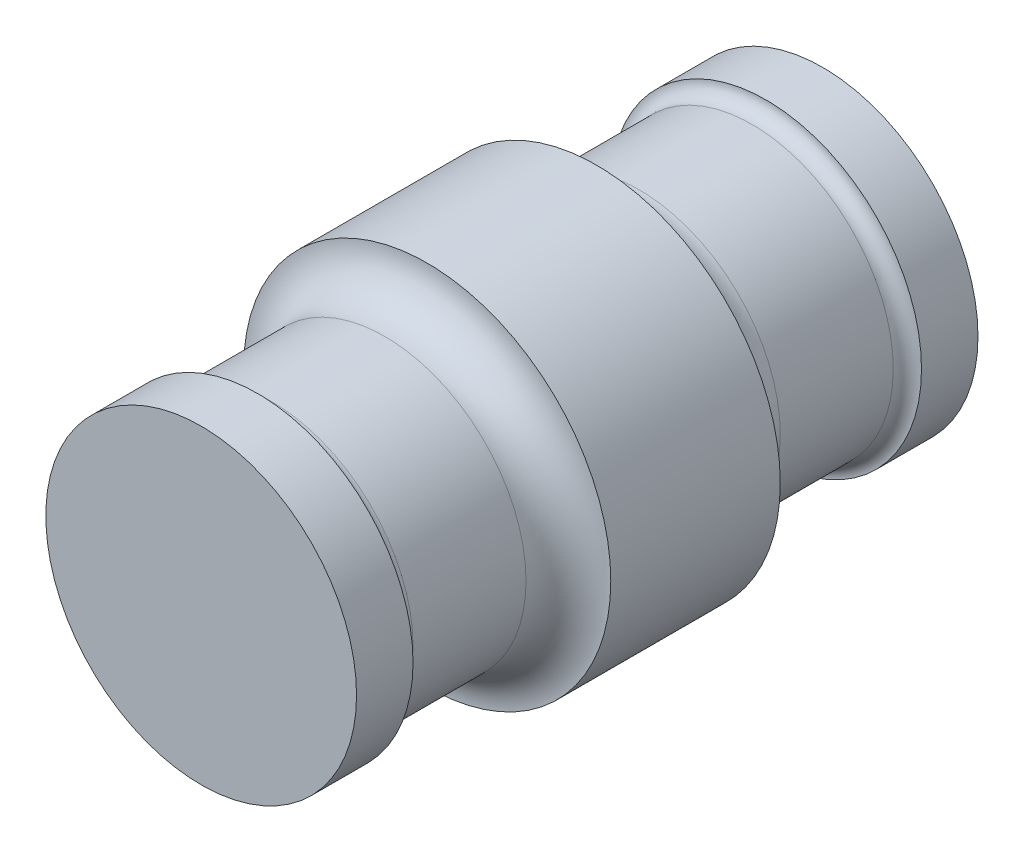
ISO-10303-21;
HEADER;
FILE_DESCRIPTION(('STEP AP214'),'2;1');
FILE_NAME('part.step','',(''),(''),'','','');
FILE_SCHEMA(('AUTOMOTIVE_DESIGN { 1 0 10303 214 1 1 1 1 }'));
ENDSEC;
DATA;
#1=APPLICATION_CONTEXT('core data for automotive mechanical design processes');
#2=APPLICATION_PROTOCOL_DEFINITION('international standard','automotive_design',2000,#1);
#3=PRODUCT_CONTEXT('',#1,'mechanical');
#4=PRODUCT('Part','Part','',(#3));
#5=PRODUCT_RELATED_PRODUCT_CATEGORY('part','',(#4));
#6=PRODUCT_DEFINITION_FORMATION('','',#4);
#7=PRODUCT_DEFINITION_CONTEXT('part definition',#1,'design');
#8=PRODUCT_DEFINITION('design','',#6,#7);
#9=PRODUCT_DEFINITION_SHAPE('','',#8);
#10=(LENGTH_UNIT() NAMED_UNIT(*) SI_UNIT(.MILLI.,.METRE.));
#11=(NAMED_UNIT(*) PLANE_ANGLE_UNIT() SI_UNIT($,.RADIAN.));
#12=(NAMED_UNIT(*) SI_UNIT($,.STERADIAN.) SOLID_ANGLE_UNIT());
#13=UNCERTAINTY_MEASURE_WITH_UNIT(LENGTH_MEASURE(1.E-05),#10,'distance_accuracy_value','');
#14=(GEOMETRIC_REPRESENTATION_CONTEXT(3) GLOBAL_UNCERTAINTY_ASSIGNED_CONTEXT((#13)) GLOBAL_UNIT_ASSIGNED_CONTEXT((#10,
#11,#12)) REPRESENTATION_CONTEXT('',''));
#15=CARTESIAN_POINT('',(0.,0.,0.));
#16=DIRECTION('',(0.,0.,1.));
#17=DIRECTION('',(1.,0.,0.));
#18=AXIS2_PLACEMENT_3D('',#15,#16,#17);
#19=CARTESIAN_POINT('',(0.,0.,6.));
#20=DIRECTION('',(0.,0.,-1.));
#21=DIRECTION('',(-1.,0.,0.));
#22=AXIS2_PLACEMENT_3D('',#19,#20,#21);
#23=CYLINDRICAL_SURFACE('',#22,5.);
#24=CARTESIAN_POINT('',(0.,0.,5.5));
#25=DIRECTION('',(0.,0.,1.));
#26=DIRECTION('',(1.,0.,0.));
#27=AXIS2_PLACEMENT_3D('',#24,#25,#26);
#28=CIRCLE('',#27,5.);
#29=CARTESIAN_POINT('',(5.,0.,5.5));
#30=VERTEX_POINT('',#29);
#31=EDGE_CURVE('E10',#30,#30,#28,.F.);
#32=ORIENTED_EDGE('',*,*,#31,.T.);
#33=EDGE_LOOP('',(#32));
#34=FACE_BOUND('',#33,.T.);
#35=CARTESIAN_POINT('',(0.,0.,1.5));
#36=DIRECTION('',(0.,0.,1.));
#37=DIRECTION('',(1.,0.,0.));
#38=AXIS2_PLACEMENT_3D('',#35,#36,#37);
#39=CIRCLE('',#38,5.);
#40=CARTESIAN_POINT('',(5.,0.,1.5));
#41=VERTEX_POINT('',#40);
#42=EDGE_CURVE('E63',#41,#41,#39,.T.);
#43=ORIENTED_EDGE('',*,*,#42,.T.);
#44=EDGE_LOOP('',(#43));
#45=FACE_BOUND('',#44,.T.);
#46=ADVANCED_FACE('F45',(#34,#45),#23,.T.);
#47=CARTESIAN_POINT('',(0.,0.,-6.));
#48=DIRECTION('',(0.,0.,1.));
#49=DIRECTION('',(1.,0.,0.));
#50=AXIS2_PLACEMENT_3D('',#47,#48,#49);
#51=CYLINDRICAL_SURFACE('',#50,6.5);
#52=CARTESIAN_POINT('',(0.,0.,-6.));
#53=DIRECTION('',(0.,0.,1.));
#54=DIRECTION('',(1.,0.,0.));
#55=AXIS2_PLACEMENT_3D('',#52,#53,#54);
#56=CIRCLE('',#55,6.5);
#57=CARTESIAN_POINT('',(6.5,0.,-6.));
#58=VERTEX_POINT('',#57);
#59=EDGE_CURVE('E69',#58,#58,#56,.T.);
#60=ORIENTED_EDGE('',*,*,#59,.T.);
#61=EDGE_LOOP('',(#60));
#62=FACE_BOUND('',#61,.T.);
#63=CARTESIAN_POINT('',(0.,0.,0.));
#64=DIRECTION('',(0.,0.,1.));
#65=DIRECTION('',(1.,0.,0.));
#66=AXIS2_PLACEMENT_3D('',#63,#64,#65);
#67=CIRCLE('',#66,6.5);
#68=CARTESIAN_POINT('',(6.5,0.,0.));
#69=VERTEX_POINT('',#68);
#70=EDGE_CURVE('E70',#69,#69,#67,.T.);
#71=ORIENTED_EDGE('',*,*,#70,.F.);
#72=EDGE_LOOP('',(#71));
#73=FACE_BOUND('',#72,.T.);
#74=ADVANCED_FACE('F109',(#62,#73),#51,.T.);
#75=CARTESIAN_POINT('',(0.,0.,-12.));
#76=DIRECTION('',(0.,0.,1.));
#77=DIRECTION('',(1.,0.,0.));
#78=AXIS2_PLACEMENT_3D('',#75,#76,#77);
#79=CYLINDRICAL_SURFACE('',#78,5.);
#80=CARTESIAN_POINT('',(0.,0.,-11.5));
#81=DIRECTION('',(0.,0.,1.));
#82=DIRECTION('',(1.,0.,0.));
#83=AXIS2_PLACEMENT_3D('',#80,#81,#82);
#84=CIRCLE('',#83,5.);
#85=CARTESIAN_POINT('',(5.,0.,-11.5));
#86=VERTEX_POINT('',#85);
#87=EDGE_CURVE('E53',#86,#86,#84,.T.);
#88=ORIENTED_EDGE('',*,*,#87,.T.);
#89=EDGE_LOOP('',(#88));
#90=FACE_BOUND('',#89,.T.);
#91=CARTESIAN_POINT('',(0.,0.,-7.5));
#92=DIRECTION('',(0.,0.,1.));
#93=DIRECTION('',(1.,0.,0.));
#94=AXIS2_PLACEMENT_3D('',#91,#92,#93);
#95=CIRCLE('',#94,5.);
#96=CARTESIAN_POINT('',(5.,0.,-7.5));
#97=VERTEX_POINT('',#96);
#98=EDGE_CURVE('E58',#97,#97,#95,.F.);
#99=ORIENTED_EDGE('',*,*,#98,.T.);
#100=EDGE_LOOP('',(#99));
#101=FACE_BOUND('',#100,.T.);
#102=ADVANCED_FACE('F115',(#90,#101),#79,.T.);
#103=CARTESIAN_POINT('',(0.,0.,1.5));
#104=DIRECTION('',(0.,0.,1.));
#105=DIRECTION('',(1.,0.,0.));
#106=AXIS2_PLACEMENT_3D('',#103,#104,#105);
#107=TOROIDAL_SURFACE('',#106,6.5,1.5);
#108=ORIENTED_EDGE('',*,*,#70,.T.);
#109=EDGE_LOOP('',(#108));
#110=FACE_BOUND('',#109,.T.);
#111=ORIENTED_EDGE('',*,*,#42,.F.);
#112=EDGE_LOOP('',(#111));
#113=FACE_BOUND('',#112,.T.);
#114=ADVANCED_FACE('F121',(#110,#113),#107,.F.);
#115=CARTESIAN_POINT('',(0.,0.,-7.5));
#116=DIRECTION('',(0.,0.,1.));
#117=DIRECTION('',(1.,0.,0.));
#118=AXIS2_PLACEMENT_3D('',#115,#116,#117);
#119=TOROIDAL_SURFACE('',#118,6.5,1.5);
#120=ORIENTED_EDGE('',*,*,#98,.F.);
#121=EDGE_LOOP('',(#120));
#122=FACE_BOUND('',#121,.T.);
#123=ORIENTED_EDGE('',*,*,#59,.F.);
#124=EDGE_LOOP('',(#123));
#125=FACE_BOUND('',#124,.T.);
#126=ADVANCED_FACE('F124',(#122,#125),#119,.F.);
#127=CARTESIAN_POINT('',(0.,0.,8.));
#128=DIRECTION('',(0.,0.,-1.));
#129=DIRECTION('',(-1.,0.,0.));
#130=AXIS2_PLACEMENT_3D('',#127,#128,#129);
#131=CYLINDRICAL_SURFACE('',#130,5.5);
#132=CARTESIAN_POINT('',(0.,0.,8.));
#133=DIRECTION('',(0.,0.,1.));
#134=DIRECTION('',(1.,0.,0.));
#135=AXIS2_PLACEMENT_3D('',#132,#133,#134);
#136=CIRCLE('',#135,5.5);
#137=CARTESIAN_POINT('',(5.5,0.,8.));
#138=VERTEX_POINT('',#137);
#139=EDGE_CURVE('E74',#138,#138,#136,.T.);
#140=ORIENTED_EDGE('',*,*,#139,.F.);
#141=EDGE_LOOP('',(#140));
#142=FACE_BOUND('',#141,.T.);
#143=CARTESIAN_POINT('',(0.,0.,6.));
#144=DIRECTION('',(0.,0.,1.));
#145=DIRECTION('',(1.,0.,0.));
#146=AXIS2_PLACEMENT_3D('',#143,#144,#145);
#147=CIRCLE('',#146,5.5);
#148=CARTESIAN_POINT('',(5.5,0.,6.));
#149=VERTEX_POINT('',#148);
#150=EDGE_CURVE('E78',#149,#149,#147,.T.);
#151=ORIENTED_EDGE('',*,*,#150,.T.);
#152=EDGE_LOOP('',(#151));
#153=FACE_BOUND('',#152,.T.);
#154=ADVANCED_FACE('F127',(#142,#153),#131,.T.);
#155=CARTESIAN_POINT('',(0.,0.,8.));
#156=DIRECTION('',(0.,0.,1.));
#157=DIRECTION('',(1.,0.,0.));
#158=AXIS2_PLACEMENT_3D('',#155,#156,#157);
#159=PLANE('',#158);
#160=ORIENTED_EDGE('',*,*,#139,.T.);
#161=EDGE_LOOP('',(#160));
#162=FACE_BOUND('',#161,.T.);
#163=ADVANCED_FACE('F107',(#162),#159,.T.);
#164=CARTESIAN_POINT('',(0.,0.,-14.));
#165=DIRECTION('',(0.,0.,1.));
#166=DIRECTION('',(1.,0.,0.));
#167=AXIS2_PLACEMENT_3D('',#164,#165,#166);
#168=CYLINDRICAL_SURFACE('',#167,5.5);
#169=CARTESIAN_POINT('',(0.,0.,-14.));
#170=DIRECTION('',(0.,0.,1.));
#171=DIRECTION('',(1.,0.,0.));
#172=AXIS2_PLACEMENT_3D('',#169,#170,#171);
#173=CIRCLE('',#172,5.5);
#174=CARTESIAN_POINT('',(5.5,0.,-14.));
#175=VERTEX_POINT('',#174);
#176=EDGE_CURVE('E82',#175,#175,#173,.T.);
#177=ORIENTED_EDGE('',*,*,#176,.T.);
#178=EDGE_LOOP('',(#177));
#179=FACE_BOUND('',#178,.T.);
#180=CARTESIAN_POINT('',(0.,0.,-12.));
#181=DIRECTION('',(0.,0.,1.));
#182=DIRECTION('',(1.,0.,0.));
#183=AXIS2_PLACEMENT_3D('',#180,#181,#182);
#184=CIRCLE('',#183,5.5);
#185=CARTESIAN_POINT('',(5.5,0.,-12.));
#186=VERTEX_POINT('',#185);
#187=EDGE_CURVE('E86',#186,#186,#184,.T.);
#188=ORIENTED_EDGE('',*,*,#187,.F.);
#189=EDGE_LOOP('',(#188));
#190=FACE_BOUND('',#189,.T.);
#191=ADVANCED_FACE('F94',(#179,#190),#168,.T.);
#192=CARTESIAN_POINT('',(0.,0.,-14.));
#193=DIRECTION('',(0.,0.,1.));
#194=DIRECTION('',(1.,0.,0.));
#195=AXIS2_PLACEMENT_3D('',#192,#193,#194);
#196=PLANE('',#195);
#197=ORIENTED_EDGE('',*,*,#176,.F.);
#198=EDGE_LOOP('',(#197));
#199=FACE_BOUND('',#198,.T.);
#200=ADVANCED_FACE('F97',(#199),#196,.F.);
#201=CARTESIAN_POINT('',(0.,0.,-11.5));
#202=DIRECTION('',(0.,0.,1.));
#203=DIRECTION('',(1.,0.,0.));
#204=AXIS2_PLACEMENT_3D('',#201,#202,#203);
#205=TOROIDAL_SURFACE('',#204,5.5,0.5);
#206=ORIENTED_EDGE('',*,*,#187,.T.);
#207=EDGE_LOOP('',(#206));
#208=FACE_BOUND('',#207,.T.);
#209=ORIENTED_EDGE('',*,*,#87,.F.);
#210=EDGE_LOOP('',(#209));
#211=FACE_BOUND('',#210,.T.);
#212=ADVANCED_FACE('F99',(#208,#211),#205,.F.);
#213=CARTESIAN_POINT('',(0.,0.,5.5));
#214=DIRECTION('',(0.,0.,1.));
#215=DIRECTION('',(1.,0.,0.));
#216=AXIS2_PLACEMENT_3D('',#213,#214,#215);
#217=TOROIDAL_SURFACE('',#216,5.5,0.5);
#218=ORIENTED_EDGE('',*,*,#31,.F.);
#219=EDGE_LOOP('',(#218));
#220=FACE_BOUND('',#219,.T.);
#221=ORIENTED_EDGE('',*,*,#150,.F.);
#222=EDGE_LOOP('',(#221));
#223=FACE_BOUND('',#222,.T.);
#224=ADVANCED_FACE('F47',(#220,#223),#217,.F.);
#225=CLOSED_SHELL('',(#46,#74,#102,#114,#126,#154,#163,#191,#200,#212,#224));
#226=MANIFOLD_SOLID_BREP('B2',#225);
#227=ADVANCED_BREP_SHAPE_REPRESENTATION('',(#18,#226),#14);
#228=SHAPE_DEFINITION_REPRESENTATION(#9,#227);
ENDSEC;
END-ISO-10303-21;
